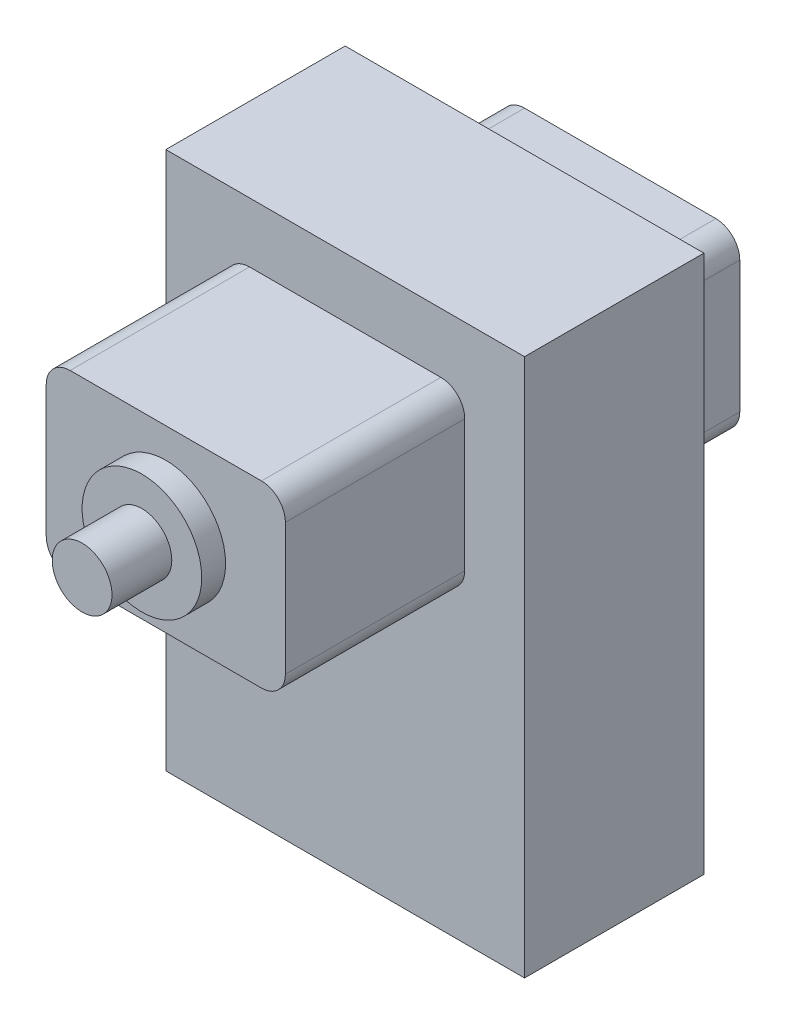
ISO-10303-21;
HEADER;
FILE_DESCRIPTION(('STEP AP214'),'2;1');
FILE_NAME('part.step','',(''),(''),'','','');
FILE_SCHEMA(('AUTOMOTIVE_DESIGN { 1 0 10303 214 1 1 1 1 }'));
ENDSEC;
DATA;
#1=APPLICATION_CONTEXT('core data for automotive mechanical design processes');
#2=APPLICATION_PROTOCOL_DEFINITION('international standard','automotive_design',2000,#1);
#3=PRODUCT_CONTEXT('',#1,'mechanical');
#4=PRODUCT('Part','Part','',(#3));
#5=PRODUCT_RELATED_PRODUCT_CATEGORY('part','',(#4));
#6=PRODUCT_DEFINITION_FORMATION('','',#4);
#7=PRODUCT_DEFINITION_CONTEXT('part definition',#1,'design');
#8=PRODUCT_DEFINITION('design','',#6,#7);
#9=PRODUCT_DEFINITION_SHAPE('','',#8);
#10=(LENGTH_UNIT() NAMED_UNIT(*) SI_UNIT(.MILLI.,.METRE.));
#11=(NAMED_UNIT(*) PLANE_ANGLE_UNIT() SI_UNIT($,.RADIAN.));
#12=(NAMED_UNIT(*) SI_UNIT($,.STERADIAN.) SOLID_ANGLE_UNIT());
#13=UNCERTAINTY_MEASURE_WITH_UNIT(LENGTH_MEASURE(1.E-05),#10,'distance_accuracy_value','');
#14=(GEOMETRIC_REPRESENTATION_CONTEXT(3) GLOBAL_UNCERTAINTY_ASSIGNED_CONTEXT((#13)) GLOBAL_UNIT_ASSIGNED_CONTEXT((#10,
#11,#12)) REPRESENTATION_CONTEXT('',''));
#15=CARTESIAN_POINT('',(0.,0.,0.));
#16=DIRECTION('',(0.,0.,1.));
#17=DIRECTION('',(1.,0.,0.));
#18=AXIS2_PLACEMENT_3D('',#15,#16,#17);
#19=CARTESIAN_POINT('',(0.,0.,0.));
#20=DIRECTION('',(0.,0.,1.));
#21=DIRECTION('',(1.,0.,0.));
#22=AXIS2_PLACEMENT_3D('',#19,#20,#21);
#23=PLANE('',#22);
#24=DIRECTION('',(0.,-1.,0.));
#25=VECTOR('',#24,1.);
#26=CARTESIAN_POINT('',(-30.,45.,0.));
#27=LINE('',#26,#25);
#28=CARTESIAN_POINT('',(-30.,45.,0.));
#29=VERTEX_POINT('',#28);
#30=CARTESIAN_POINT('',(-30.,0.,0.));
#31=VERTEX_POINT('',#30);
#32=EDGE_CURVE('E206',#29,#31,#27,.T.);
#33=ORIENTED_EDGE('',*,*,#32,.F.);
#34=DIRECTION('',(-1.,0.,0.));
#35=VECTOR('',#34,1.);
#36=CARTESIAN_POINT('',(-30.,45.,0.));
#37=LINE('',#36,#35);
#38=CARTESIAN_POINT('',(0.,45.,0.));
#39=VERTEX_POINT('',#38);
#40=EDGE_CURVE('E202',#39,#29,#37,.T.);
#41=ORIENTED_EDGE('',*,*,#40,.F.);
#42=DIRECTION('',(0.,1.,0.));
#43=VECTOR('',#42,1.);
#44=CARTESIAN_POINT('',(0.,45.,0.));
#45=LINE('',#44,#43);
#46=CARTESIAN_POINT('',(0.,0.,0.));
#47=VERTEX_POINT('',#46);
#48=EDGE_CURVE('E394',#47,#39,#45,.T.);
#49=ORIENTED_EDGE('',*,*,#48,.F.);
#50=DIRECTION('',(1.,0.,0.));
#51=VECTOR('',#50,1.);
#52=CARTESIAN_POINT('',(-30.,0.,0.));
#53=LINE('',#52,#51);
#54=EDGE_CURVE('E391',#31,#47,#53,.T.);
#55=ORIENTED_EDGE('',*,*,#54,.F.);
#56=EDGE_LOOP('',(#33,#41,#49,#55));
#57=FACE_BOUND('',#56,.T.);
#58=DIRECTION('',(0.,-1.,0.));
#59=VECTOR('',#58,1.);
#60=CARTESIAN_POINT('',(-5.,40.,0.));
#61=LINE('',#60,#59);
#62=CARTESIAN_POINT('',(-5.,38.,0.));
#63=VERTEX_POINT('',#62);
#64=CARTESIAN_POINT('',(-5.,27.,0.));
#65=VERTEX_POINT('',#64);
#66=EDGE_CURVE('E340',#63,#65,#61,.T.);
#67=ORIENTED_EDGE('',*,*,#66,.F.);
#68=CARTESIAN_POINT('',(-7.,38.,0.));
#69=DIRECTION('',(0.,0.,1.));
#70=DIRECTION('',(1.,0.,0.));
#71=AXIS2_PLACEMENT_3D('',#68,#69,#70);
#72=CIRCLE('',#71,2.);
#73=CARTESIAN_POINT('',(-7.,40.,0.));
#74=VERTEX_POINT('',#73);
#75=EDGE_CURVE('E57',#63,#74,#72,.T.);
#76=ORIENTED_EDGE('',*,*,#75,.T.);
#77=DIRECTION('',(1.,0.,0.));
#78=VECTOR('',#77,1.);
#79=CARTESIAN_POINT('',(-5.,40.,0.));
#80=LINE('',#79,#78);
#81=CARTESIAN_POINT('',(-23.,40.,0.));
#82=VERTEX_POINT('',#81);
#83=EDGE_CURVE('E327',#82,#74,#80,.T.);
#84=ORIENTED_EDGE('',*,*,#83,.F.);
#85=CARTESIAN_POINT('',(-23.,38.,0.));
#86=DIRECTION('',(0.,0.,1.));
#87=DIRECTION('',(1.,0.,0.));
#88=AXIS2_PLACEMENT_3D('',#85,#86,#87);
#89=CIRCLE('',#88,2.);
#90=CARTESIAN_POINT('',(-25.,38.,0.));
#91=VERTEX_POINT('',#90);
#92=EDGE_CURVE('E43',#82,#91,#89,.T.);
#93=ORIENTED_EDGE('',*,*,#92,.T.);
#94=DIRECTION('',(0.,1.,0.));
#95=VECTOR('',#94,1.);
#96=CARTESIAN_POINT('',(-25.,40.,0.));
#97=LINE('',#96,#95);
#98=CARTESIAN_POINT('',(-25.,27.,0.));
#99=VERTEX_POINT('',#98);
#100=EDGE_CURVE('E348',#99,#91,#97,.T.);
#101=ORIENTED_EDGE('',*,*,#100,.F.);
#102=CARTESIAN_POINT('',(-23.,27.,0.));
#103=DIRECTION('',(0.,0.,1.));
#104=DIRECTION('',(1.,0.,0.));
#105=AXIS2_PLACEMENT_3D('',#102,#103,#104);
#106=CIRCLE('',#105,2.);
#107=CARTESIAN_POINT('',(-23.,25.,0.));
#108=VERTEX_POINT('',#107);
#109=EDGE_CURVE('E308',#99,#108,#106,.T.);
#110=ORIENTED_EDGE('',*,*,#109,.T.);
#111=DIRECTION('',(-1.,0.,0.));
#112=VECTOR('',#111,1.);
#113=CARTESIAN_POINT('',(-5.,25.,0.));
#114=LINE('',#113,#112);
#115=CARTESIAN_POINT('',(-7.,25.,0.));
#116=VERTEX_POINT('',#115);
#117=EDGE_CURVE('E344',#116,#108,#114,.T.);
#118=ORIENTED_EDGE('',*,*,#117,.F.);
#119=CARTESIAN_POINT('',(-7.,27.,0.));
#120=DIRECTION('',(0.,0.,1.));
#121=DIRECTION('',(1.,0.,0.));
#122=AXIS2_PLACEMENT_3D('',#119,#120,#121);
#123=CIRCLE('',#122,2.);
#124=EDGE_CURVE('E305',#116,#65,#123,.T.);
#125=ORIENTED_EDGE('',*,*,#124,.T.);
#126=EDGE_LOOP('',(#67,#76,#84,#93,#101,#110,#118,#125));
#127=FACE_BOUND('',#126,.T.);
#128=ADVANCED_FACE('F39',(#57,#127),#23,.F.);
#129=CARTESIAN_POINT('',(-30.,45.,15.));
#130=DIRECTION('',(1.,0.,0.));
#131=DIRECTION('',(0.,0.,-1.));
#132=AXIS2_PLACEMENT_3D('',#129,#130,#131);
#133=PLANE('',#132);
#134=ORIENTED_EDGE('',*,*,#32,.T.);
#135=DIRECTION('',(0.,0.,-1.));
#136=VECTOR('',#135,1.);
#137=CARTESIAN_POINT('',(-30.,0.,15.));
#138=LINE('',#137,#136);
#139=CARTESIAN_POINT('',(-30.,0.,15.));
#140=VERTEX_POINT('',#139);
#141=EDGE_CURVE('E184',#140,#31,#138,.T.);
#142=ORIENTED_EDGE('',*,*,#141,.F.);
#143=DIRECTION('',(0.,-1.,0.));
#144=VECTOR('',#143,1.);
#145=CARTESIAN_POINT('',(-30.,45.,15.));
#146=LINE('',#145,#144);
#147=CARTESIAN_POINT('',(-30.,45.,15.));
#148=VERTEX_POINT('',#147);
#149=EDGE_CURVE('E192',#148,#140,#146,.T.);
#150=ORIENTED_EDGE('',*,*,#149,.F.);
#151=DIRECTION('',(0.,0.,-1.));
#152=VECTOR('',#151,1.);
#153=CARTESIAN_POINT('',(-30.,45.,15.));
#154=LINE('',#153,#152);
#155=EDGE_CURVE('E388',#148,#29,#154,.T.);
#156=ORIENTED_EDGE('',*,*,#155,.T.);
#157=EDGE_LOOP('',(#134,#142,#150,#156));
#158=FACE_BOUND('',#157,.T.);
#159=ADVANCED_FACE('F204',(#158),#133,.F.);
#160=CARTESIAN_POINT('',(-30.,0.,15.));
#161=DIRECTION('',(0.,1.,0.));
#162=DIRECTION('',(0.,0.,1.));
#163=AXIS2_PLACEMENT_3D('',#160,#161,#162);
#164=PLANE('',#163);
#165=ORIENTED_EDGE('',*,*,#54,.T.);
#166=DIRECTION('',(0.,0.,-1.));
#167=VECTOR('',#166,1.);
#168=CARTESIAN_POINT('',(0.,0.,15.));
#169=LINE('',#168,#167);
#170=CARTESIAN_POINT('',(0.,0.,15.));
#171=VERTEX_POINT('',#170);
#172=EDGE_CURVE('E187',#171,#47,#169,.T.);
#173=ORIENTED_EDGE('',*,*,#172,.F.);
#174=DIRECTION('',(1.,0.,0.));
#175=VECTOR('',#174,1.);
#176=CARTESIAN_POINT('',(-30.,0.,15.));
#177=LINE('',#176,#175);
#178=EDGE_CURVE('E180',#140,#171,#177,.T.);
#179=ORIENTED_EDGE('',*,*,#178,.F.);
#180=ORIENTED_EDGE('',*,*,#141,.T.);
#181=EDGE_LOOP('',(#165,#173,#179,#180));
#182=FACE_BOUND('',#181,.T.);
#183=ADVANCED_FACE('F182',(#182),#164,.F.);
#184=CARTESIAN_POINT('',(0.,45.,15.));
#185=DIRECTION('',(-1.,0.,0.));
#186=DIRECTION('',(0.,0.,1.));
#187=AXIS2_PLACEMENT_3D('',#184,#185,#186);
#188=PLANE('',#187);
#189=ORIENTED_EDGE('',*,*,#48,.T.);
#190=DIRECTION('',(0.,0.,-1.));
#191=VECTOR('',#190,1.);
#192=CARTESIAN_POINT('',(0.,45.,15.));
#193=LINE('',#192,#191);
#194=CARTESIAN_POINT('',(0.,45.,15.));
#195=VERTEX_POINT('',#194);
#196=EDGE_CURVE('E214',#195,#39,#193,.T.);
#197=ORIENTED_EDGE('',*,*,#196,.F.);
#198=DIRECTION('',(0.,1.,0.));
#199=VECTOR('',#198,1.);
#200=CARTESIAN_POINT('',(0.,45.,15.));
#201=LINE('',#200,#199);
#202=EDGE_CURVE('E191',#171,#195,#201,.T.);
#203=ORIENTED_EDGE('',*,*,#202,.F.);
#204=ORIENTED_EDGE('',*,*,#172,.T.);
#205=EDGE_LOOP('',(#189,#197,#203,#204));
#206=FACE_BOUND('',#205,.T.);
#207=ADVANCED_FACE('F409',(#206),#188,.F.);
#208=CARTESIAN_POINT('',(-30.,45.,15.));
#209=DIRECTION('',(0.,-1.,0.));
#210=DIRECTION('',(1.,0.,0.));
#211=AXIS2_PLACEMENT_3D('',#208,#209,#210);
#212=PLANE('',#211);
#213=ORIENTED_EDGE('',*,*,#40,.T.);
#214=ORIENTED_EDGE('',*,*,#155,.F.);
#215=DIRECTION('',(-1.,0.,0.));
#216=VECTOR('',#215,1.);
#217=CARTESIAN_POINT('',(-30.,45.,15.));
#218=LINE('',#217,#216);
#219=EDGE_CURVE('E197',#195,#148,#218,.T.);
#220=ORIENTED_EDGE('',*,*,#219,.F.);
#221=ORIENTED_EDGE('',*,*,#196,.T.);
#222=EDGE_LOOP('',(#213,#214,#220,#221));
#223=FACE_BOUND('',#222,.T.);
#224=ADVANCED_FACE('F405',(#223),#212,.F.);
#225=CARTESIAN_POINT('',(0.,0.,15.));
#226=DIRECTION('',(0.,0.,1.));
#227=DIRECTION('',(1.,0.,0.));
#228=AXIS2_PLACEMENT_3D('',#225,#226,#227);
#229=PLANE('',#228);
#230=DIRECTION('',(0.,-1.,0.));
#231=VECTOR('',#230,1.);
#232=CARTESIAN_POINT('',(-25.,40.,15.));
#233=LINE('',#232,#231);
#234=CARTESIAN_POINT('',(-25.,38.,15.));
#235=VERTEX_POINT('',#234);
#236=CARTESIAN_POINT('',(-25.,27.,15.));
#237=VERTEX_POINT('',#236);
#238=EDGE_CURVE('E339',#235,#237,#233,.T.);
#239=ORIENTED_EDGE('',*,*,#238,.F.);
#240=CARTESIAN_POINT('',(-23.,38.,15.));
#241=DIRECTION('',(0.,0.,1.));
#242=DIRECTION('',(1.,0.,0.));
#243=AXIS2_PLACEMENT_3D('',#240,#241,#242);
#244=CIRCLE('',#243,2.);
#245=CARTESIAN_POINT('',(-23.,40.,15.));
#246=VERTEX_POINT('',#245);
#247=EDGE_CURVE('E293',#235,#246,#244,.F.);
#248=ORIENTED_EDGE('',*,*,#247,.T.);
#249=DIRECTION('',(-1.,0.,0.));
#250=VECTOR('',#249,1.);
#251=CARTESIAN_POINT('',(-25.,40.,15.));
#252=LINE('',#251,#250);
#253=CARTESIAN_POINT('',(-7.,40.,15.));
#254=VERTEX_POINT('',#253);
#255=EDGE_CURVE('E358',#254,#246,#252,.T.);
#256=ORIENTED_EDGE('',*,*,#255,.F.);
#257=CARTESIAN_POINT('',(-7.,38.,15.));
#258=DIRECTION('',(0.,0.,1.));
#259=DIRECTION('',(1.,0.,0.));
#260=AXIS2_PLACEMENT_3D('',#257,#258,#259);
#261=CIRCLE('',#260,2.);
#262=CARTESIAN_POINT('',(-5.,38.,15.));
#263=VERTEX_POINT('',#262);
#264=EDGE_CURVE('E302',#254,#263,#261,.F.);
#265=ORIENTED_EDGE('',*,*,#264,.T.);
#266=DIRECTION('',(0.,1.,0.));
#267=VECTOR('',#266,1.);
#268=CARTESIAN_POINT('',(-5.,40.,15.));
#269=LINE('',#268,#267);
#270=CARTESIAN_POINT('',(-5.,27.,15.));
#271=VERTEX_POINT('',#270);
#272=EDGE_CURVE('E377',#271,#263,#269,.T.);
#273=ORIENTED_EDGE('',*,*,#272,.F.);
#274=CARTESIAN_POINT('',(-7.,27.,15.));
#275=DIRECTION('',(0.,0.,1.));
#276=DIRECTION('',(1.,0.,0.));
#277=AXIS2_PLACEMENT_3D('',#274,#275,#276);
#278=CIRCLE('',#277,2.);
#279=CARTESIAN_POINT('',(-7.,25.,15.));
#280=VERTEX_POINT('',#279);
#281=EDGE_CURVE('E299',#271,#280,#278,.F.);
#282=ORIENTED_EDGE('',*,*,#281,.T.);
#283=DIRECTION('',(1.,0.,0.));
#284=VECTOR('',#283,1.);
#285=CARTESIAN_POINT('',(-25.,25.,15.));
#286=LINE('',#285,#284);
#287=CARTESIAN_POINT('',(-23.,25.,15.));
#288=VERTEX_POINT('',#287);
#289=EDGE_CURVE('E373',#288,#280,#286,.T.);
#290=ORIENTED_EDGE('',*,*,#289,.F.);
#291=CARTESIAN_POINT('',(-23.,27.,15.));
#292=DIRECTION('',(0.,0.,1.));
#293=DIRECTION('',(1.,0.,0.));
#294=AXIS2_PLACEMENT_3D('',#291,#292,#293);
#295=CIRCLE('',#294,2.);
#296=EDGE_CURVE('E296',#288,#237,#295,.F.);
#297=ORIENTED_EDGE('',*,*,#296,.T.);
#298=EDGE_LOOP('',(#239,#248,#256,#265,#273,#282,#290,#297));
#299=FACE_BOUND('',#298,.T.);
#300=ORIENTED_EDGE('',*,*,#149,.T.);
#301=ORIENTED_EDGE('',*,*,#178,.T.);
#302=ORIENTED_EDGE('',*,*,#202,.T.);
#303=ORIENTED_EDGE('',*,*,#219,.T.);
#304=EDGE_LOOP('',(#300,#301,#302,#303));
#305=FACE_BOUND('',#304,.T.);
#306=ADVANCED_FACE('F195',(#299,#305),#229,.T.);
#307=CARTESIAN_POINT('',(-25.,40.,30.));
#308=DIRECTION('',(1.,0.,0.));
#309=DIRECTION('',(0.,0.,-1.));
#310=AXIS2_PLACEMENT_3D('',#307,#308,#309);
#311=PLANE('',#310);
#312=DIRECTION('',(0.,-1.,0.));
#313=VECTOR('',#312,1.);
#314=CARTESIAN_POINT('',(-25.,40.,30.));
#315=LINE('',#314,#313);
#316=CARTESIAN_POINT('',(-25.,38.,30.));
#317=VERTEX_POINT('',#316);
#318=CARTESIAN_POINT('',(-25.,27.,30.));
#319=VERTEX_POINT('',#318);
#320=EDGE_CURVE('E353',#317,#319,#315,.T.);
#321=ORIENTED_EDGE('',*,*,#320,.F.);
#322=DIRECTION('',(0.,0.,-1.));
#323=VECTOR('',#322,1.);
#324=CARTESIAN_POINT('',(-25.,38.,30.));
#325=LINE('',#324,#323);
#326=EDGE_CURVE('E212',#317,#235,#325,.T.);
#327=ORIENTED_EDGE('',*,*,#326,.T.);
#328=ORIENTED_EDGE('',*,*,#238,.T.);
#329=DIRECTION('',(0.,0.,-1.));
#330=VECTOR('',#329,1.);
#331=CARTESIAN_POINT('',(-25.,27.,30.));
#332=LINE('',#331,#330);
#333=EDGE_CURVE('E208',#237,#319,#332,.F.);
#334=ORIENTED_EDGE('',*,*,#333,.T.);
#335=EDGE_LOOP('',(#321,#327,#328,#334));
#336=FACE_BOUND('',#335,.T.);
#337=ADVANCED_FACE('F427',(#336),#311,.F.);
#338=CARTESIAN_POINT('',(-25.,25.,30.));
#339=DIRECTION('',(0.,1.,0.));
#340=DIRECTION('',(0.,0.,1.));
#341=AXIS2_PLACEMENT_3D('',#338,#339,#340);
#342=PLANE('',#341);
#343=DIRECTION('',(1.,0.,0.));
#344=VECTOR('',#343,1.);
#345=CARTESIAN_POINT('',(-25.,25.,30.));
#346=LINE('',#345,#344);
#347=CARTESIAN_POINT('',(-23.,25.,30.));
#348=VERTEX_POINT('',#347);
#349=CARTESIAN_POINT('',(-7.,25.,30.));
#350=VERTEX_POINT('',#349);
#351=EDGE_CURVE('E357',#348,#350,#346,.T.);
#352=ORIENTED_EDGE('',*,*,#351,.F.);
#353=DIRECTION('',(0.,0.,-1.));
#354=VECTOR('',#353,1.);
#355=CARTESIAN_POINT('',(-23.,25.,30.));
#356=LINE('',#355,#354);
#357=EDGE_CURVE('E243',#348,#288,#356,.T.);
#358=ORIENTED_EDGE('',*,*,#357,.T.);
#359=ORIENTED_EDGE('',*,*,#289,.T.);
#360=DIRECTION('',(0.,0.,-1.));
#361=VECTOR('',#360,1.);
#362=CARTESIAN_POINT('',(-7.,25.,30.));
#363=LINE('',#362,#361);
#364=EDGE_CURVE('E240',#280,#350,#363,.F.);
#365=ORIENTED_EDGE('',*,*,#364,.T.);
#366=EDGE_LOOP('',(#352,#358,#359,#365));
#367=FACE_BOUND('',#366,.T.);
#368=ADVANCED_FACE('F431',(#367),#342,.F.);
#369=CARTESIAN_POINT('',(-5.,40.,30.));
#370=DIRECTION('',(-1.,0.,0.));
#371=DIRECTION('',(0.,0.,1.));
#372=AXIS2_PLACEMENT_3D('',#369,#370,#371);
#373=PLANE('',#372);
#374=DIRECTION('',(0.,1.,0.));
#375=VECTOR('',#374,1.);
#376=CARTESIAN_POINT('',(-5.,40.,30.));
#377=LINE('',#376,#375);
#378=CARTESIAN_POINT('',(-5.,27.,30.));
#379=VERTEX_POINT('',#378);
#380=CARTESIAN_POINT('',(-5.,38.,30.));
#381=VERTEX_POINT('',#380);
#382=EDGE_CURVE('E362',#379,#381,#377,.T.);
#383=ORIENTED_EDGE('',*,*,#382,.F.);
#384=DIRECTION('',(0.,0.,-1.));
#385=VECTOR('',#384,1.);
#386=CARTESIAN_POINT('',(-5.,27.,30.));
#387=LINE('',#386,#385);
#388=EDGE_CURVE('E250',#379,#271,#387,.T.);
#389=ORIENTED_EDGE('',*,*,#388,.T.);
#390=ORIENTED_EDGE('',*,*,#272,.T.);
#391=DIRECTION('',(0.,0.,-1.));
#392=VECTOR('',#391,1.);
#393=CARTESIAN_POINT('',(-5.,38.,30.));
#394=LINE('',#393,#392);
#395=EDGE_CURVE('E247',#263,#381,#394,.F.);
#396=ORIENTED_EDGE('',*,*,#395,.T.);
#397=EDGE_LOOP('',(#383,#389,#390,#396));
#398=FACE_BOUND('',#397,.T.);
#399=ADVANCED_FACE('F435',(#398),#373,.F.);
#400=CARTESIAN_POINT('',(-25.,40.,30.));
#401=DIRECTION('',(0.,-1.,0.));
#402=DIRECTION('',(0.,0.,-1.));
#403=AXIS2_PLACEMENT_3D('',#400,#401,#402);
#404=PLANE('',#403);
#405=ORIENTED_EDGE('',*,*,#255,.T.);
#406=DIRECTION('',(0.,0.,-1.));
#407=VECTOR('',#406,1.);
#408=CARTESIAN_POINT('',(-23.,40.,30.));
#409=LINE('',#408,#407);
#410=CARTESIAN_POINT('',(-23.,40.,30.));
#411=VERTEX_POINT('',#410);
#412=EDGE_CURVE('E225',#246,#411,#409,.F.);
#413=ORIENTED_EDGE('',*,*,#412,.T.);
#414=DIRECTION('',(-1.,0.,0.));
#415=VECTOR('',#414,1.);
#416=CARTESIAN_POINT('',(-25.,40.,30.));
#417=LINE('',#416,#415);
#418=CARTESIAN_POINT('',(-7.,40.,30.));
#419=VERTEX_POINT('',#418);
#420=EDGE_CURVE('E366',#419,#411,#417,.T.);
#421=ORIENTED_EDGE('',*,*,#420,.F.);
#422=DIRECTION('',(0.,0.,-1.));
#423=VECTOR('',#422,1.);
#424=CARTESIAN_POINT('',(-7.,40.,30.));
#425=LINE('',#424,#423);
#426=EDGE_CURVE('E221',#419,#254,#425,.T.);
#427=ORIENTED_EDGE('',*,*,#426,.T.);
#428=EDGE_LOOP('',(#405,#413,#421,#427));
#429=FACE_BOUND('',#428,.T.);
#430=ADVANCED_FACE('F439',(#429),#404,.F.);
#431=CARTESIAN_POINT('',(0.,0.,30.));
#432=DIRECTION('',(0.,0.,1.));
#433=DIRECTION('',(1.,0.,0.));
#434=AXIS2_PLACEMENT_3D('',#431,#432,#433);
#435=PLANE('',#434);
#436=CARTESIAN_POINT('',(-15.,32.5,30.));
#437=DIRECTION('',(0.,0.,1.));
#438=DIRECTION('',(1.,0.,0.));
#439=AXIS2_PLACEMENT_3D('',#436,#437,#438);
#440=CIRCLE('',#439,5.);
#441=CARTESIAN_POINT('',(-10.,32.5,30.));
#442=VERTEX_POINT('',#441);
#443=EDGE_CURVE('E49',#442,#442,#440,.T.);
#444=ORIENTED_EDGE('',*,*,#443,.F.);
#445=EDGE_LOOP('',(#444));
#446=FACE_BOUND('',#445,.T.);
#447=ORIENTED_EDGE('',*,*,#420,.T.);
#448=CARTESIAN_POINT('',(-23.,38.,30.));
#449=DIRECTION('',(0.,0.,1.));
#450=DIRECTION('',(1.,0.,0.));
#451=AXIS2_PLACEMENT_3D('',#448,#449,#450);
#452=CIRCLE('',#451,2.);
#453=EDGE_CURVE('E237',#411,#317,#452,.T.);
#454=ORIENTED_EDGE('',*,*,#453,.T.);
#455=ORIENTED_EDGE('',*,*,#320,.T.);
#456=CARTESIAN_POINT('',(-23.,27.,30.));
#457=DIRECTION('',(0.,0.,1.));
#458=DIRECTION('',(1.,0.,0.));
#459=AXIS2_PLACEMENT_3D('',#456,#457,#458);
#460=CIRCLE('',#459,2.);
#461=EDGE_CURVE('E234',#319,#348,#460,.T.);
#462=ORIENTED_EDGE('',*,*,#461,.T.);
#463=ORIENTED_EDGE('',*,*,#351,.T.);
#464=CARTESIAN_POINT('',(-7.,27.,30.));
#465=DIRECTION('',(0.,0.,1.));
#466=DIRECTION('',(1.,0.,0.));
#467=AXIS2_PLACEMENT_3D('',#464,#465,#466);
#468=CIRCLE('',#467,2.);
#469=EDGE_CURVE('E231',#350,#379,#468,.T.);
#470=ORIENTED_EDGE('',*,*,#469,.T.);
#471=ORIENTED_EDGE('',*,*,#382,.T.);
#472=CARTESIAN_POINT('',(-7.,38.,30.));
#473=DIRECTION('',(0.,0.,1.));
#474=DIRECTION('',(1.,0.,0.));
#475=AXIS2_PLACEMENT_3D('',#472,#473,#474);
#476=CIRCLE('',#475,2.);
#477=EDGE_CURVE('E228',#381,#419,#476,.T.);
#478=ORIENTED_EDGE('',*,*,#477,.T.);
#479=EDGE_LOOP('',(#447,#454,#455,#462,#463,#470,#471,#478));
#480=FACE_BOUND('',#479,.T.);
#481=ADVANCED_FACE('F443',(#446,#480),#435,.T.);
#482=CARTESIAN_POINT('',(-5.,40.,-8.));
#483=DIRECTION('',(-1.,0.,0.));
#484=DIRECTION('',(0.,-1.,0.));
#485=AXIS2_PLACEMENT_3D('',#482,#483,#484);
#486=PLANE('',#485);
#487=ORIENTED_EDGE('',*,*,#66,.T.);
#488=DIRECTION('',(0.,0.,1.));
#489=VECTOR('',#488,1.);
#490=CARTESIAN_POINT('',(-5.,27.,-8.));
#491=LINE('',#490,#489);
#492=CARTESIAN_POINT('',(-5.,27.,-8.));
#493=VERTEX_POINT('',#492);
#494=EDGE_CURVE('E265',#65,#493,#491,.F.);
#495=ORIENTED_EDGE('',*,*,#494,.T.);
#496=DIRECTION('',(0.,-1.,0.));
#497=VECTOR('',#496,1.);
#498=CARTESIAN_POINT('',(-5.,40.,-8.));
#499=LINE('',#498,#497);
#500=CARTESIAN_POINT('',(-5.,38.,-8.));
#501=VERTEX_POINT('',#500);
#502=EDGE_CURVE('E322',#501,#493,#499,.T.);
#503=ORIENTED_EDGE('',*,*,#502,.F.);
#504=DIRECTION('',(0.,0.,1.));
#505=VECTOR('',#504,1.);
#506=CARTESIAN_POINT('',(-5.,38.,-8.));
#507=LINE('',#506,#505);
#508=EDGE_CURVE('E261',#501,#63,#507,.T.);
#509=ORIENTED_EDGE('',*,*,#508,.T.);
#510=EDGE_LOOP('',(#487,#495,#503,#509));
#511=FACE_BOUND('',#510,.T.);
#512=ADVANCED_FACE('F447',(#511),#486,.F.);
#513=CARTESIAN_POINT('',(-5.,25.,-8.));
#514=DIRECTION('',(0.,1.,0.));
#515=DIRECTION('',(0.,0.,1.));
#516=AXIS2_PLACEMENT_3D('',#513,#514,#515);
#517=PLANE('',#516);
#518=DIRECTION('',(-1.,0.,0.));
#519=VECTOR('',#518,1.);
#520=CARTESIAN_POINT('',(-5.,25.,-8.));
#521=LINE('',#520,#519);
#522=CARTESIAN_POINT('',(-7.,25.,-8.));
#523=VERTEX_POINT('',#522);
#524=CARTESIAN_POINT('',(-23.,25.,-8.));
#525=VERTEX_POINT('',#524);
#526=EDGE_CURVE('E326',#523,#525,#521,.T.);
#527=ORIENTED_EDGE('',*,*,#526,.F.);
#528=DIRECTION('',(0.,0.,1.));
#529=VECTOR('',#528,1.);
#530=CARTESIAN_POINT('',(-7.,25.,-8.));
#531=LINE('',#530,#529);
#532=EDGE_CURVE('E257',#523,#116,#531,.T.);
#533=ORIENTED_EDGE('',*,*,#532,.T.);
#534=ORIENTED_EDGE('',*,*,#117,.T.);
#535=DIRECTION('',(0.,0.,1.));
#536=VECTOR('',#535,1.);
#537=CARTESIAN_POINT('',(-23.,25.,-8.));
#538=LINE('',#537,#536);
#539=EDGE_CURVE('E254',#108,#525,#538,.F.);
#540=ORIENTED_EDGE('',*,*,#539,.T.);
#541=EDGE_LOOP('',(#527,#533,#534,#540));
#542=FACE_BOUND('',#541,.T.);
#543=ADVANCED_FACE('F451',(#542),#517,.F.);
#544=CARTESIAN_POINT('',(-25.,40.,-8.));
#545=DIRECTION('',(1.,0.,0.));
#546=DIRECTION('',(0.,1.,0.));
#547=AXIS2_PLACEMENT_3D('',#544,#545,#546);
#548=PLANE('',#547);
#549=DIRECTION('',(0.,1.,0.));
#550=VECTOR('',#549,1.);
#551=CARTESIAN_POINT('',(-25.,40.,-8.));
#552=LINE('',#551,#550);
#553=CARTESIAN_POINT('',(-25.,27.,-8.));
#554=VERTEX_POINT('',#553);
#555=CARTESIAN_POINT('',(-25.,38.,-8.));
#556=VERTEX_POINT('',#555);
#557=EDGE_CURVE('E331',#554,#556,#552,.T.);
#558=ORIENTED_EDGE('',*,*,#557,.F.);
#559=DIRECTION('',(0.,0.,1.));
#560=VECTOR('',#559,1.);
#561=CARTESIAN_POINT('',(-25.,27.,-8.));
#562=LINE('',#561,#560);
#563=EDGE_CURVE('E283',#554,#99,#562,.T.);
#564=ORIENTED_EDGE('',*,*,#563,.T.);
#565=ORIENTED_EDGE('',*,*,#100,.T.);
#566=DIRECTION('',(0.,0.,1.));
#567=VECTOR('',#566,1.);
#568=CARTESIAN_POINT('',(-25.,38.,-8.));
#569=LINE('',#568,#567);
#570=EDGE_CURVE('E280',#91,#556,#569,.F.);
#571=ORIENTED_EDGE('',*,*,#570,.T.);
#572=EDGE_LOOP('',(#558,#564,#565,#571));
#573=FACE_BOUND('',#572,.T.);
#574=ADVANCED_FACE('F455',(#573),#548,.F.);
#575=CARTESIAN_POINT('',(-5.,40.,-8.));
#576=DIRECTION('',(0.,-1.,0.));
#577=DIRECTION('',(0.,0.,-1.));
#578=AXIS2_PLACEMENT_3D('',#575,#576,#577);
#579=PLANE('',#578);
#580=ORIENTED_EDGE('',*,*,#83,.T.);
#581=DIRECTION('',(0.,0.,1.));
#582=VECTOR('',#581,1.);
#583=CARTESIAN_POINT('',(-7.,40.,-8.));
#584=LINE('',#583,#582);
#585=CARTESIAN_POINT('',(-7.,40.,-8.));
#586=VERTEX_POINT('',#585);
#587=EDGE_CURVE('E290',#74,#586,#584,.F.);
#588=ORIENTED_EDGE('',*,*,#587,.T.);
#589=DIRECTION('',(1.,0.,0.));
#590=VECTOR('',#589,1.);
#591=CARTESIAN_POINT('',(-5.,40.,-8.));
#592=LINE('',#591,#590);
#593=CARTESIAN_POINT('',(-23.,40.,-8.));
#594=VERTEX_POINT('',#593);
#595=EDGE_CURVE('E335',#594,#586,#592,.T.);
#596=ORIENTED_EDGE('',*,*,#595,.F.);
#597=DIRECTION('',(0.,0.,1.));
#598=VECTOR('',#597,1.);
#599=CARTESIAN_POINT('',(-23.,40.,-8.));
#600=LINE('',#599,#598);
#601=EDGE_CURVE('E287',#594,#82,#600,.T.);
#602=ORIENTED_EDGE('',*,*,#601,.T.);
#603=EDGE_LOOP('',(#580,#588,#596,#602));
#604=FACE_BOUND('',#603,.T.);
#605=ADVANCED_FACE('F459',(#604),#579,.F.);
#606=CARTESIAN_POINT('',(0.,0.,-8.));
#607=DIRECTION('',(0.,0.,-1.));
#608=DIRECTION('',(-1.,0.,0.));
#609=AXIS2_PLACEMENT_3D('',#606,#607,#608);
#610=PLANE('',#609);
#611=ORIENTED_EDGE('',*,*,#502,.T.);
#612=CARTESIAN_POINT('',(-7.,27.,-8.));
#613=DIRECTION('',(0.,0.,-1.));
#614=DIRECTION('',(-1.,0.,0.));
#615=AXIS2_PLACEMENT_3D('',#612,#613,#614);
#616=CIRCLE('',#615,2.);
#617=EDGE_CURVE('E277',#493,#523,#616,.T.);
#618=ORIENTED_EDGE('',*,*,#617,.T.);
#619=ORIENTED_EDGE('',*,*,#526,.T.);
#620=CARTESIAN_POINT('',(-23.,27.,-8.));
#621=DIRECTION('',(0.,0.,-1.));
#622=DIRECTION('',(-1.,0.,0.));
#623=AXIS2_PLACEMENT_3D('',#620,#621,#622);
#624=CIRCLE('',#623,2.);
#625=EDGE_CURVE('E274',#525,#554,#624,.T.);
#626=ORIENTED_EDGE('',*,*,#625,.T.);
#627=ORIENTED_EDGE('',*,*,#557,.T.);
#628=CARTESIAN_POINT('',(-23.,38.,-8.));
#629=DIRECTION('',(0.,0.,-1.));
#630=DIRECTION('',(-1.,0.,0.));
#631=AXIS2_PLACEMENT_3D('',#628,#629,#630);
#632=CIRCLE('',#631,2.);
#633=EDGE_CURVE('E268',#556,#594,#632,.T.);
#634=ORIENTED_EDGE('',*,*,#633,.T.);
#635=ORIENTED_EDGE('',*,*,#595,.T.);
#636=CARTESIAN_POINT('',(-7.,38.,-8.));
#637=DIRECTION('',(0.,0.,-1.));
#638=DIRECTION('',(-1.,0.,0.));
#639=AXIS2_PLACEMENT_3D('',#636,#637,#638);
#640=CIRCLE('',#639,2.);
#641=EDGE_CURVE('E271',#586,#501,#640,.T.);
#642=ORIENTED_EDGE('',*,*,#641,.T.);
#643=EDGE_LOOP('',(#611,#618,#619,#626,#627,#634,#635,#642));
#644=FACE_BOUND('',#643,.T.);
#645=ADVANCED_FACE('F463',(#644),#610,.T.);
#646=CARTESIAN_POINT('',(-23.,38.,30.));
#647=DIRECTION('',(0.,0.,-1.));
#648=DIRECTION('',(-1.,0.,0.));
#649=AXIS2_PLACEMENT_3D('',#646,#647,#648);
#650=CYLINDRICAL_SURFACE('',#649,2.);
#651=ORIENTED_EDGE('',*,*,#453,.F.);
#652=ORIENTED_EDGE('',*,*,#412,.F.);
#653=ORIENTED_EDGE('',*,*,#247,.F.);
#654=ORIENTED_EDGE('',*,*,#326,.F.);
#655=EDGE_LOOP('',(#651,#652,#653,#654));
#656=FACE_BOUND('',#655,.T.);
#657=ADVANCED_FACE('F467',(#656),#650,.T.);
#658=CARTESIAN_POINT('',(-23.,27.,30.));
#659=DIRECTION('',(0.,0.,-1.));
#660=DIRECTION('',(-1.,0.,0.));
#661=AXIS2_PLACEMENT_3D('',#658,#659,#660);
#662=CYLINDRICAL_SURFACE('',#661,2.);
#663=ORIENTED_EDGE('',*,*,#461,.F.);
#664=ORIENTED_EDGE('',*,*,#333,.F.);
#665=ORIENTED_EDGE('',*,*,#296,.F.);
#666=ORIENTED_EDGE('',*,*,#357,.F.);
#667=EDGE_LOOP('',(#663,#664,#665,#666));
#668=FACE_BOUND('',#667,.T.);
#669=ADVANCED_FACE('F553',(#668),#662,.T.);
#670=CARTESIAN_POINT('',(-7.,27.,30.));
#671=DIRECTION('',(0.,0.,-1.));
#672=DIRECTION('',(-1.,0.,0.));
#673=AXIS2_PLACEMENT_3D('',#670,#671,#672);
#674=CYLINDRICAL_SURFACE('',#673,2.);
#675=ORIENTED_EDGE('',*,*,#469,.F.);
#676=ORIENTED_EDGE('',*,*,#364,.F.);
#677=ORIENTED_EDGE('',*,*,#281,.F.);
#678=ORIENTED_EDGE('',*,*,#388,.F.);
#679=EDGE_LOOP('',(#675,#676,#677,#678));
#680=FACE_BOUND('',#679,.T.);
#681=ADVANCED_FACE('F545',(#680),#674,.T.);
#682=CARTESIAN_POINT('',(-7.,38.,30.));
#683=DIRECTION('',(0.,0.,-1.));
#684=DIRECTION('',(-1.,0.,0.));
#685=AXIS2_PLACEMENT_3D('',#682,#683,#684);
#686=CYLINDRICAL_SURFACE('',#685,2.);
#687=ORIENTED_EDGE('',*,*,#477,.F.);
#688=ORIENTED_EDGE('',*,*,#395,.F.);
#689=ORIENTED_EDGE('',*,*,#264,.F.);
#690=ORIENTED_EDGE('',*,*,#426,.F.);
#691=EDGE_LOOP('',(#687,#688,#689,#690));
#692=FACE_BOUND('',#691,.T.);
#693=ADVANCED_FACE('F537',(#692),#686,.T.);
#694=CARTESIAN_POINT('',(-7.,27.,-8.));
#695=DIRECTION('',(0.,0.,1.));
#696=DIRECTION('',(1.,0.,0.));
#697=AXIS2_PLACEMENT_3D('',#694,#695,#696);
#698=CYLINDRICAL_SURFACE('',#697,2.);
#699=ORIENTED_EDGE('',*,*,#617,.F.);
#700=ORIENTED_EDGE('',*,*,#494,.F.);
#701=ORIENTED_EDGE('',*,*,#124,.F.);
#702=ORIENTED_EDGE('',*,*,#532,.F.);
#703=EDGE_LOOP('',(#699,#700,#701,#702));
#704=FACE_BOUND('',#703,.T.);
#705=ADVANCED_FACE('F529',(#704),#698,.T.);
#706=CARTESIAN_POINT('',(-23.,27.,-8.));
#707=DIRECTION('',(0.,0.,1.));
#708=DIRECTION('',(1.,0.,0.));
#709=AXIS2_PLACEMENT_3D('',#706,#707,#708);
#710=CYLINDRICAL_SURFACE('',#709,2.);
#711=ORIENTED_EDGE('',*,*,#625,.F.);
#712=ORIENTED_EDGE('',*,*,#539,.F.);
#713=ORIENTED_EDGE('',*,*,#109,.F.);
#714=ORIENTED_EDGE('',*,*,#563,.F.);
#715=EDGE_LOOP('',(#711,#712,#713,#714));
#716=FACE_BOUND('',#715,.T.);
#717=ADVANCED_FACE('F522',(#716),#710,.T.);
#718=CARTESIAN_POINT('',(-7.,38.,-8.));
#719=DIRECTION('',(0.,0.,1.));
#720=DIRECTION('',(1.,0.,0.));
#721=AXIS2_PLACEMENT_3D('',#718,#719,#720);
#722=CYLINDRICAL_SURFACE('',#721,2.);
#723=ORIENTED_EDGE('',*,*,#641,.F.);
#724=ORIENTED_EDGE('',*,*,#587,.F.);
#725=ORIENTED_EDGE('',*,*,#75,.F.);
#726=ORIENTED_EDGE('',*,*,#508,.F.);
#727=EDGE_LOOP('',(#723,#724,#725,#726));
#728=FACE_BOUND('',#727,.T.);
#729=ADVANCED_FACE('F516',(#728),#722,.T.);
#730=CARTESIAN_POINT('',(-23.,38.,-8.));
#731=DIRECTION('',(0.,0.,1.));
#732=DIRECTION('',(1.,0.,0.));
#733=AXIS2_PLACEMENT_3D('',#730,#731,#732);
#734=CYLINDRICAL_SURFACE('',#733,2.);
#735=ORIENTED_EDGE('',*,*,#633,.F.);
#736=ORIENTED_EDGE('',*,*,#570,.F.);
#737=ORIENTED_EDGE('',*,*,#92,.F.);
#738=ORIENTED_EDGE('',*,*,#601,.F.);
#739=EDGE_LOOP('',(#735,#736,#737,#738));
#740=FACE_BOUND('',#739,.T.);
#741=ADVANCED_FACE('F41',(#740),#734,.T.);
#742=CARTESIAN_POINT('',(-15.,32.5,32.));
#743=DIRECTION('',(0.,0.,-1.));
#744=DIRECTION('',(-1.,0.,0.));
#745=AXIS2_PLACEMENT_3D('',#742,#743,#744);
#746=CYLINDRICAL_SURFACE('',#745,5.);
#747=CARTESIAN_POINT('',(-15.,32.5,32.));
#748=DIRECTION('',(0.,0.,1.));
#749=DIRECTION('',(1.,0.,0.));
#750=AXIS2_PLACEMENT_3D('',#747,#748,#749);
#751=CIRCLE('',#750,5.);
#752=CARTESIAN_POINT('',(-10.,32.5,32.));
#753=VERTEX_POINT('',#752);
#754=EDGE_CURVE('E321',#753,#753,#751,.T.);
#755=ORIENTED_EDGE('',*,*,#754,.F.);
#756=EDGE_LOOP('',(#755));
#757=FACE_BOUND('',#756,.T.);
#758=ORIENTED_EDGE('',*,*,#443,.T.);
#759=EDGE_LOOP('',(#758));
#760=FACE_BOUND('',#759,.T.);
#761=ADVANCED_FACE('F469',(#757,#760),#746,.T.);
#762=CARTESIAN_POINT('',(-15.,32.5,32.));
#763=DIRECTION('',(0.,0.,1.));
#764=DIRECTION('',(1.,0.,0.));
#765=AXIS2_PLACEMENT_3D('',#762,#763,#764);
#766=PLANE('',#765);
#767=CARTESIAN_POINT('',(-15.,32.5,32.));
#768=DIRECTION('',(0.,0.,1.));
#769=DIRECTION('',(1.,0.,0.));
#770=AXIS2_PLACEMENT_3D('',#767,#768,#769);
#771=CIRCLE('',#770,2.5);
#772=CARTESIAN_POINT('',(-12.5,32.5,32.));
#773=VERTEX_POINT('',#772);
#774=EDGE_CURVE('E11',#773,#773,#771,.T.);
#775=ORIENTED_EDGE('',*,*,#774,.F.);
#776=EDGE_LOOP('',(#775));
#777=FACE_BOUND('',#776,.T.);
#778=ORIENTED_EDGE('',*,*,#754,.T.);
#779=EDGE_LOOP('',(#778));
#780=FACE_BOUND('',#779,.T.);
#781=ADVANCED_FACE('F472',(#777,#780),#766,.T.);
#782=CARTESIAN_POINT('',(-15.,32.5,37.));
#783=DIRECTION('',(0.,0.,-1.));
#784=DIRECTION('',(-1.,0.,0.));
#785=AXIS2_PLACEMENT_3D('',#782,#783,#784);
#786=CYLINDRICAL_SURFACE('',#785,2.5);
#787=CARTESIAN_POINT('',(-15.,32.5,37.));
#788=DIRECTION('',(0.,0.,1.));
#789=DIRECTION('',(1.,0.,0.));
#790=AXIS2_PLACEMENT_3D('',#787,#788,#789);
#791=CIRCLE('',#790,2.5);
#792=CARTESIAN_POINT('',(-12.5,32.5,37.));
#793=VERTEX_POINT('',#792);
#794=EDGE_CURVE('E488',#793,#793,#791,.T.);
#795=ORIENTED_EDGE('',*,*,#794,.F.);
#796=EDGE_LOOP('',(#795));
#797=FACE_BOUND('',#796,.T.);
#798=ORIENTED_EDGE('',*,*,#774,.T.);
#799=EDGE_LOOP('',(#798));
#800=FACE_BOUND('',#799,.T.);
#801=ADVANCED_FACE('F476',(#797,#800),#786,.T.);
#802=CARTESIAN_POINT('',(-15.,32.5,37.));
#803=DIRECTION('',(0.,0.,1.));
#804=DIRECTION('',(1.,0.,0.));
#805=AXIS2_PLACEMENT_3D('',#802,#803,#804);
#806=PLANE('',#805);
#807=ORIENTED_EDGE('',*,*,#794,.T.);
#808=EDGE_LOOP('',(#807));
#809=FACE_BOUND('',#808,.T.);
#810=ADVANCED_FACE('F480',(#809),#806,.T.);
#811=CLOSED_SHELL('',(#128,#159,#183,#207,#224,#306,#337,#368,#399,#430,#481,#512,#543,#574,
#605,#645,#657,#669,#681,#693,#705,#717,#729,#741,#761,#781,#801,#810));
#812=MANIFOLD_SOLID_BREP('B2',#811);
#813=ADVANCED_BREP_SHAPE_REPRESENTATION('',(#18,#812),#14);
#814=SHAPE_DEFINITION_REPRESENTATION(#9,#813);
ENDSEC;
END-ISO-10303-21;
